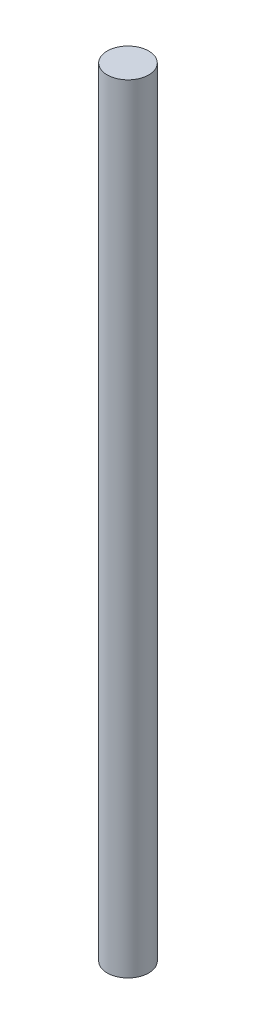
ISO-10303-21;
HEADER;
FILE_DESCRIPTION(('STEP AP214'),'2;1');
FILE_NAME('part.step','',(''),(''),'','','');
FILE_SCHEMA(('AUTOMOTIVE_DESIGN { 1 0 10303 214 1 1 1 1 }'));
ENDSEC;
DATA;
#1=APPLICATION_CONTEXT('core data for automotive mechanical design processes');
#2=APPLICATION_PROTOCOL_DEFINITION('international standard','automotive_design',2000,#1);
#3=PRODUCT_CONTEXT('',#1,'mechanical');
#4=PRODUCT('Part','Part','',(#3));
#5=PRODUCT_RELATED_PRODUCT_CATEGORY('part','',(#4));
#6=PRODUCT_DEFINITION_FORMATION('','',#4);
#7=PRODUCT_DEFINITION_CONTEXT('part definition',#1,'design');
#8=PRODUCT_DEFINITION('design','',#6,#7);
#9=PRODUCT_DEFINITION_SHAPE('','',#8);
#10=(LENGTH_UNIT() NAMED_UNIT(*) SI_UNIT(.MILLI.,.METRE.));
#11=(NAMED_UNIT(*) PLANE_ANGLE_UNIT() SI_UNIT($,.RADIAN.));
#12=(NAMED_UNIT(*) SI_UNIT($,.STERADIAN.) SOLID_ANGLE_UNIT());
#13=UNCERTAINTY_MEASURE_WITH_UNIT(LENGTH_MEASURE(1.E-05),#10,'distance_accuracy_value','');
#14=(GEOMETRIC_REPRESENTATION_CONTEXT(3) GLOBAL_UNCERTAINTY_ASSIGNED_CONTEXT((#13)) GLOBAL_UNIT_ASSIGNED_CONTEXT((#10,
#11,#12)) REPRESENTATION_CONTEXT('',''));
#15=CARTESIAN_POINT('',(0.,0.,0.));
#16=DIRECTION('',(0.,0.,1.));
#17=DIRECTION('',(1.,0.,0.));
#18=AXIS2_PLACEMENT_3D('',#15,#16,#17);
#19=CARTESIAN_POINT('',(0.,150.,0.));
#20=DIRECTION('',(0.,-1.,0.));
#21=DIRECTION('',(0.,0.,-1.));
#22=AXIS2_PLACEMENT_3D('',#19,#20,#21);
#23=CYLINDRICAL_SURFACE('',#22,4.);
#24=CARTESIAN_POINT('',(0.,150.,0.));
#25=DIRECTION('',(0.,1.,0.));
#26=DIRECTION('',(0.,0.,1.));
#27=AXIS2_PLACEMENT_3D('',#24,#25,#26);
#28=CIRCLE('',#27,4.);
#29=CARTESIAN_POINT('',(0.,150.,4.));
#30=VERTEX_POINT('',#29);
#31=EDGE_CURVE('E10',#30,#30,#28,.T.);
#32=ORIENTED_EDGE('',*,*,#31,.F.);
#33=EDGE_LOOP('',(#32));
#34=FACE_BOUND('',#33,.T.);
#35=CARTESIAN_POINT('',(0.,0.,0.));
#36=DIRECTION('',(0.,1.,0.));
#37=DIRECTION('',(0.,0.,1.));
#38=AXIS2_PLACEMENT_3D('',#35,#36,#37);
#39=CIRCLE('',#38,4.);
#40=CARTESIAN_POINT('',(0.,0.,4.));
#41=VERTEX_POINT('',#40);
#42=EDGE_CURVE('E46',#41,#41,#39,.T.);
#43=ORIENTED_EDGE('',*,*,#42,.T.);
#44=EDGE_LOOP('',(#43));
#45=FACE_BOUND('',#44,.T.);
#46=ADVANCED_FACE('F43',(#34,#45),#23,.T.);
#47=CARTESIAN_POINT('',(0.,150.,0.));
#48=DIRECTION('',(0.,1.,0.));
#49=DIRECTION('',(0.,0.,1.));
#50=AXIS2_PLACEMENT_3D('',#47,#48,#49);
#51=PLANE('',#50);
#52=ORIENTED_EDGE('',*,*,#31,.T.);
#53=EDGE_LOOP('',(#52));
#54=FACE_BOUND('',#53,.T.);
#55=ADVANCED_FACE('F60',(#54),#51,.T.);
#56=CARTESIAN_POINT('',(0.,0.,0.));
#57=DIRECTION('',(0.,1.,0.));
#58=DIRECTION('',(0.,0.,1.));
#59=AXIS2_PLACEMENT_3D('',#56,#57,#58);
#60=PLANE('',#59);
#61=ORIENTED_EDGE('',*,*,#42,.F.);
#62=EDGE_LOOP('',(#61));
#63=FACE_BOUND('',#62,.T.);
#64=ADVANCED_FACE('F58',(#63),#60,.F.);
#65=CLOSED_SHELL('',(#46,#55,#64));
#66=MANIFOLD_SOLID_BREP('B2',#65);
#67=ADVANCED_BREP_SHAPE_REPRESENTATION('',(#18,#66),#14);
#68=SHAPE_DEFINITION_REPRESENTATION(#9,#67);
ENDSEC;
END-ISO-10303-21;
